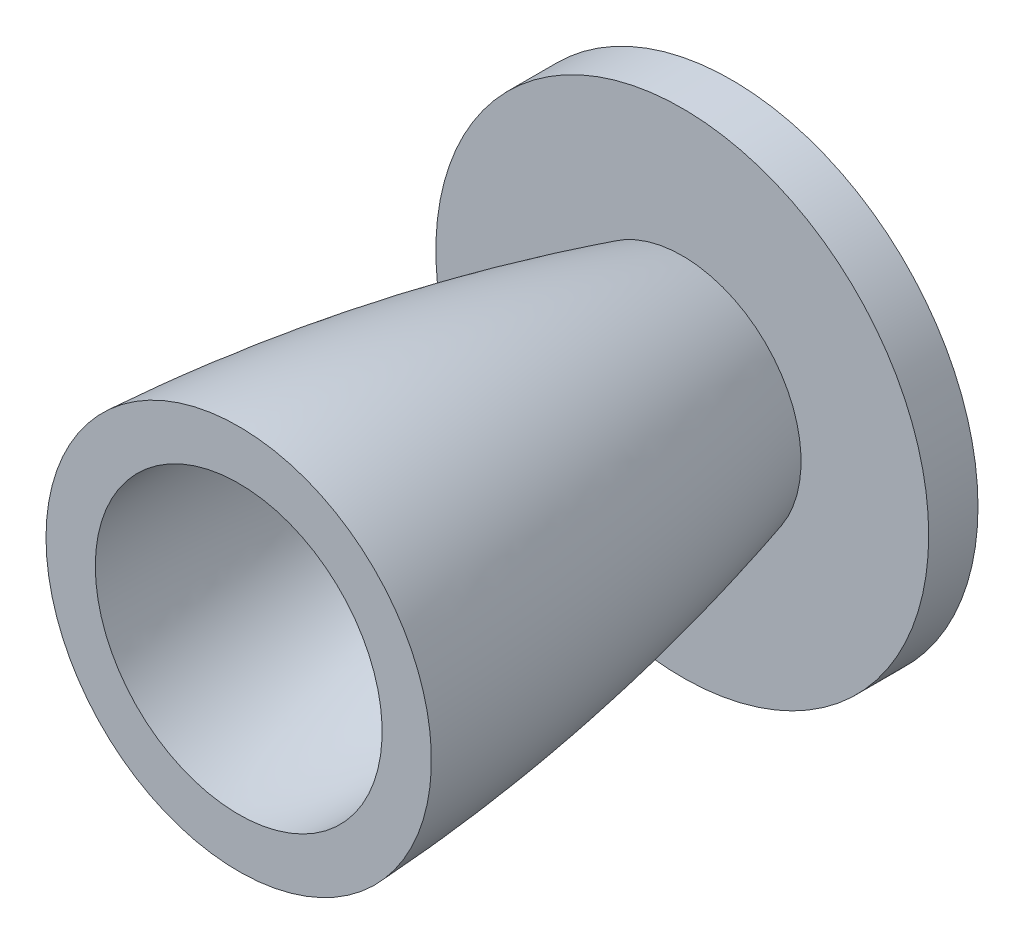
ISO-10303-21;
HEADER;
FILE_DESCRIPTION(('STEP AP214'),'2;1');
FILE_NAME('part.step','',(''),(''),'','','');
FILE_SCHEMA(('AUTOMOTIVE_DESIGN { 1 0 10303 214 1 1 1 1 }'));
ENDSEC;
DATA;
#1=APPLICATION_CONTEXT('core data for automotive mechanical design processes');
#2=APPLICATION_PROTOCOL_DEFINITION('international standard','automotive_design',2000,#1);
#3=PRODUCT_CONTEXT('',#1,'mechanical');
#4=PRODUCT('Part','Part','',(#3));
#5=PRODUCT_RELATED_PRODUCT_CATEGORY('part','',(#4));
#6=PRODUCT_DEFINITION_FORMATION('','',#4);
#7=PRODUCT_DEFINITION_CONTEXT('part definition',#1,'design');
#8=PRODUCT_DEFINITION('design','',#6,#7);
#9=PRODUCT_DEFINITION_SHAPE('','',#8);
#10=(LENGTH_UNIT() NAMED_UNIT(*) SI_UNIT(.MILLI.,.METRE.));
#11=(NAMED_UNIT(*) PLANE_ANGLE_UNIT() SI_UNIT($,.RADIAN.));
#12=(NAMED_UNIT(*) SI_UNIT($,.STERADIAN.) SOLID_ANGLE_UNIT());
#13=UNCERTAINTY_MEASURE_WITH_UNIT(LENGTH_MEASURE(1.E-05),#10,'distance_accuracy_value','');
#14=(GEOMETRIC_REPRESENTATION_CONTEXT(3) GLOBAL_UNCERTAINTY_ASSIGNED_CONTEXT((#13)) GLOBAL_UNIT_ASSIGNED_CONTEXT((#10,
#11,#12)) REPRESENTATION_CONTEXT('',''));
#15=CARTESIAN_POINT('',(0.,0.,0.));
#16=DIRECTION('',(0.,0.,1.));
#17=DIRECTION('',(1.,0.,0.));
#18=AXIS2_PLACEMENT_3D('',#15,#16,#17);
#19=CARTESIAN_POINT('',(0.,0.,100.));
#20=DIRECTION('',(0.,0.,1.));
#21=DIRECTION('',(1.,0.,0.));
#22=AXIS2_PLACEMENT_3D('',#19,#20,#21);
#23=PLANE('',#22);
#24=CARTESIAN_POINT('',(0.,0.,100.));
#25=DIRECTION('',(0.,0.,1.));
#26=DIRECTION('',(1.,0.,0.));
#27=AXIS2_PLACEMENT_3D('',#24,#25,#26);
#28=CIRCLE('',#27,500.);
#29=CARTESIAN_POINT('',(500.,0.,100.));
#30=VERTEX_POINT('',#29);
#31=EDGE_CURVE('E10',#30,#30,#28,.T.);
#32=ORIENTED_EDGE('',*,*,#31,.T.);
#33=EDGE_LOOP('',(#32));
#34=FACE_BOUND('',#33,.T.);
#35=CARTESIAN_POINT('',(0.,0.,100.));
#36=DIRECTION('',(0.,0.,-1.));
#37=DIRECTION('',(-1.,0.,0.));
#38=AXIS2_PLACEMENT_3D('',#35,#36,#37);
#39=CIRCLE('',#38,241.001086436407);
#40=CARTESIAN_POINT('',(-241.001086436407,0.,100.));
#41=VERTEX_POINT('',#40);
#42=EDGE_CURVE('E48',#41,#41,#39,.T.);
#43=ORIENTED_EDGE('',*,*,#42,.T.);
#44=EDGE_LOOP('',(#43));
#45=FACE_BOUND('',#44,.T.);
#46=ADVANCED_FACE('F30',(#34,#45),#23,.T.);
#47=CARTESIAN_POINT('',(0.,0.,100.));
#48=DIRECTION('',(0.,0.,-1.));
#49=DIRECTION('',(-1.,0.,0.));
#50=AXIS2_PLACEMENT_3D('',#47,#48,#49);
#51=CYLINDRICAL_SURFACE('',#50,500.);
#52=ORIENTED_EDGE('',*,*,#31,.F.);
#53=EDGE_LOOP('',(#52));
#54=FACE_BOUND('',#53,.T.);
#55=CARTESIAN_POINT('',(0.,0.,0.));
#56=DIRECTION('',(0.,0.,1.));
#57=DIRECTION('',(1.,0.,0.));
#58=AXIS2_PLACEMENT_3D('',#55,#56,#57);
#59=CIRCLE('',#58,500.);
#60=CARTESIAN_POINT('',(500.,0.,0.));
#61=VERTEX_POINT('',#60);
#62=EDGE_CURVE('E34',#61,#61,#59,.T.);
#63=ORIENTED_EDGE('',*,*,#62,.T.);
#64=EDGE_LOOP('',(#63));
#65=FACE_BOUND('',#64,.T.);
#66=ADVANCED_FACE('F32',(#54,#65),#51,.T.);
#67=CARTESIAN_POINT('',(0.,0.,0.));
#68=DIRECTION('',(0.,0.,1.));
#69=DIRECTION('',(1.,0.,0.));
#70=AXIS2_PLACEMENT_3D('',#67,#68,#69);
#71=PLANE('',#70);
#72=ORIENTED_EDGE('',*,*,#62,.F.);
#73=EDGE_LOOP('',(#72));
#74=FACE_BOUND('',#73,.T.);
#75=ADVANCED_FACE('F85',(#74),#71,.F.);
#76=CARTESIAN_POINT('',(191.001086436407,0.,281.617154630875));
#77=CARTESIAN_POINT('',(305.65500095572,0.,631.798317470928));
#78=CARTESIAN_POINT('',(291.001086436408,0.,1000.));
#79=B_SPLINE_CURVE_WITH_KNOTS('',2,(#76,#77,#78),.UNSPECIFIED.,.F.,.F.,(3,3),(0.,1.),.UNSPECIFIED.);
#80=CARTESIAN_POINT('',(0.,0.,-166.849755884975));
#81=DIRECTION('',(0.,0.,-1.));
#82=AXIS1_PLACEMENT('',#80,#81);
#83=SURFACE_OF_REVOLUTION('',#79,#82);
#84=CARTESIAN_POINT('',(0.,0.,1000.));
#85=DIRECTION('',(0.,0.,-1.));
#86=DIRECTION('',(-1.,0.,0.));
#87=AXIS2_PLACEMENT_3D('',#84,#85,#86);
#88=CIRCLE('',#87,291.001086436408);
#89=CARTESIAN_POINT('',(-291.001086436408,0.,1000.));
#90=VERTEX_POINT('',#89);
#91=EDGE_CURVE('E41',#90,#90,#88,.T.);
#92=ORIENTED_EDGE('',*,*,#91,.F.);
#93=EDGE_LOOP('',(#92));
#94=FACE_BOUND('',#93,.T.);
#95=CARTESIAN_POINT('',(0.,0.,281.617154630875));
#96=DIRECTION('',(0.,0.,-1.));
#97=DIRECTION('',(-1.,0.,0.));
#98=AXIS2_PLACEMENT_3D('',#95,#96,#97);
#99=CIRCLE('',#98,191.001086436407);
#100=CARTESIAN_POINT('',(-191.001086436407,0.,281.617154630875));
#101=VERTEX_POINT('',#100);
#102=EDGE_CURVE('E57',#101,#101,#99,.T.);
#103=ORIENTED_EDGE('',*,*,#102,.T.);
#104=EDGE_LOOP('',(#103));
#105=FACE_BOUND('',#104,.T.);
#106=ADVANCED_FACE('F81',(#94,#105),#83,.T.);
#107=CARTESIAN_POINT('',(291.001086436408,0.,1000.));
#108=DIRECTION('',(0.,0.,-1.));
#109=DIRECTION('',(-1.,0.,0.));
#110=AXIS2_PLACEMENT_3D('',#107,#108,#109);
#111=PLANE('',#110);
#112=CARTESIAN_POINT('',(0.,0.,1000.));
#113=DIRECTION('',(0.,0.,-1.));
#114=DIRECTION('',(-1.,0.,0.));
#115=AXIS2_PLACEMENT_3D('',#112,#113,#114);
#116=CIRCLE('',#115,391.001086436408);
#117=CARTESIAN_POINT('',(-391.001086436408,0.,1000.));
#118=VERTEX_POINT('',#117);
#119=EDGE_CURVE('E45',#118,#118,#116,.T.);
#120=ORIENTED_EDGE('',*,*,#119,.F.);
#121=EDGE_LOOP('',(#120));
#122=FACE_BOUND('',#121,.T.);
#123=ORIENTED_EDGE('',*,*,#91,.T.);
#124=EDGE_LOOP('',(#123));
#125=FACE_BOUND('',#124,.T.);
#126=ADVANCED_FACE('F76',(#122,#125),#111,.F.);
#127=CARTESIAN_POINT('',(391.001086436407,0.,1000.));
#128=CARTESIAN_POINT('',(365.645053482558,0.,541.84497732268));
#129=CARTESIAN_POINT('',(241.001086436407,0.,100.));
#130=B_SPLINE_CURVE_WITH_KNOTS('',2,(#127,#128,#129),.UNSPECIFIED.,.F.,.F.,(3,3),(0.,1.),.UNSPECIFIED.);
#131=CARTESIAN_POINT('',(0.,0.,-166.849755884975));
#132=DIRECTION('',(0.,0.,-1.));
#133=AXIS1_PLACEMENT('',#131,#132);
#134=SURFACE_OF_REVOLUTION('',#130,#133);
#135=ORIENTED_EDGE('',*,*,#42,.F.);
#136=EDGE_LOOP('',(#135));
#137=FACE_BOUND('',#136,.T.);
#138=ORIENTED_EDGE('',*,*,#119,.T.);
#139=EDGE_LOOP('',(#138));
#140=FACE_BOUND('',#139,.T.);
#141=ADVANCED_FACE('F71',(#137,#140),#134,.T.);
#142=CARTESIAN_POINT('',(0.,0.,-166.849755884975));
#143=DIRECTION('',(0.,0.,-1.));
#144=DIRECTION('',(-1.,0.,0.));
#145=AXIS2_PLACEMENT_3D('',#142,#143,#144);
#146=CYLINDRICAL_SURFACE('',#145,91.0010864364075);
#147=CARTESIAN_POINT('',(0.,0.,281.617154630875));
#148=DIRECTION('',(0.,0.,-1.));
#149=DIRECTION('',(-1.,0.,0.));
#150=AXIS2_PLACEMENT_3D('',#147,#148,#149);
#151=CIRCLE('',#150,91.0010864364075);
#152=CARTESIAN_POINT('',(-91.0010864364075,0.,281.617154630875));
#153=VERTEX_POINT('',#152);
#154=EDGE_CURVE('E54',#153,#153,#151,.T.);
#155=ORIENTED_EDGE('',*,*,#154,.F.);
#156=EDGE_LOOP('',(#155));
#157=FACE_BOUND('',#156,.T.);
#158=CARTESIAN_POINT('',(0.,0.,100.));
#159=DIRECTION('',(0.,0.,-1.));
#160=DIRECTION('',(-1.,0.,0.));
#161=AXIS2_PLACEMENT_3D('',#158,#159,#160);
#162=CIRCLE('',#161,91.0010864364075);
#163=CARTESIAN_POINT('',(-91.0010864364075,0.,100.));
#164=VERTEX_POINT('',#163);
#165=EDGE_CURVE('E51',#164,#164,#162,.T.);
#166=ORIENTED_EDGE('',*,*,#165,.T.);
#167=EDGE_LOOP('',(#166));
#168=FACE_BOUND('',#167,.T.);
#169=ADVANCED_FACE('F75',(#157,#168),#146,.F.);
#170=CARTESIAN_POINT('',(191.001086436407,0.,281.617154630875));
#171=DIRECTION('',(0.,0.,-1.));
#172=DIRECTION('',(-1.,0.,0.));
#173=AXIS2_PLACEMENT_3D('',#170,#171,#172);
#174=PLANE('',#173);
#175=ORIENTED_EDGE('',*,*,#102,.F.);
#176=EDGE_LOOP('',(#175));
#177=FACE_BOUND('',#176,.T.);
#178=ORIENTED_EDGE('',*,*,#154,.T.);
#179=EDGE_LOOP('',(#178));
#180=FACE_BOUND('',#179,.T.);
#181=ADVANCED_FACE('F133',(#177,#180),#174,.F.);
#182=ORIENTED_EDGE('',*,*,#165,.F.);
#183=EDGE_LOOP('',(#182));
#184=FACE_BOUND('',#183,.T.);
#185=ADVANCED_FACE('F88',(#184),#23,.T.);
#186=CLOSED_SHELL('',(#46,#66,#75,#106,#126,#141,#169,#181,#185));
#187=MANIFOLD_SOLID_BREP('B2',#186);
#188=ADVANCED_BREP_SHAPE_REPRESENTATION('',(#18,#187),#14);
#189=SHAPE_DEFINITION_REPRESENTATION(#9,#188);
ENDSEC;
END-ISO-10303-21;
